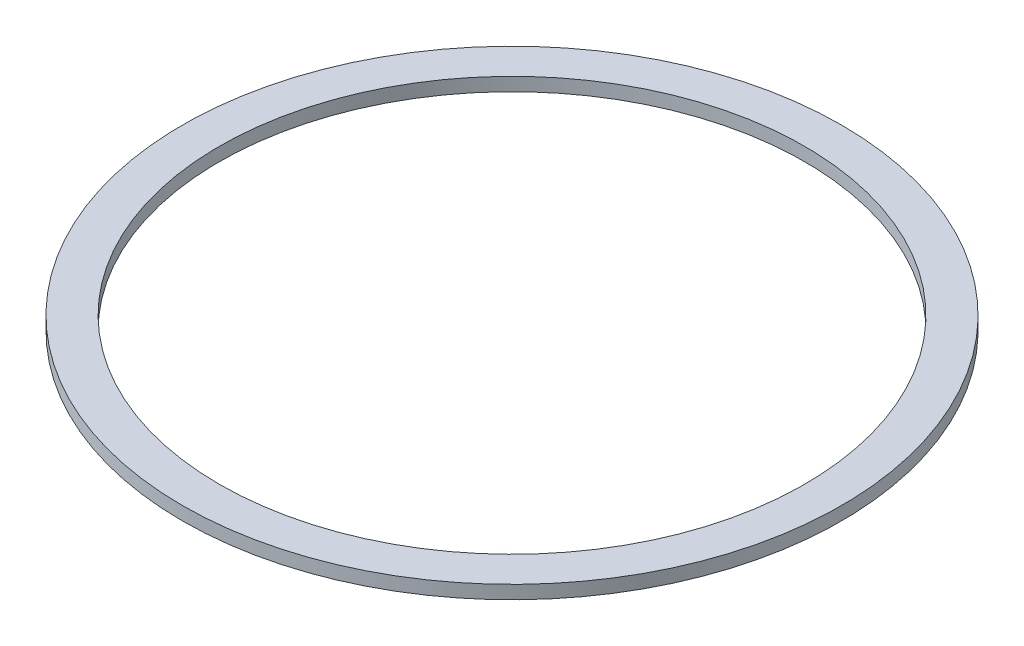
ISO-10303-21;
HEADER;
FILE_DESCRIPTION(('STEP AP214'),'2;1');
FILE_NAME('part.step','',(''),(''),'','','');
FILE_SCHEMA(('AUTOMOTIVE_DESIGN { 1 0 10303 214 1 1 1 1 }'));
ENDSEC;
DATA;
#1=APPLICATION_CONTEXT('core data for automotive mechanical design processes');
#2=APPLICATION_PROTOCOL_DEFINITION('international standard','automotive_design',2000,#1);
#3=PRODUCT_CONTEXT('',#1,'mechanical');
#4=PRODUCT('Part','Part','',(#3));
#5=PRODUCT_RELATED_PRODUCT_CATEGORY('part','',(#4));
#6=PRODUCT_DEFINITION_FORMATION('','',#4);
#7=PRODUCT_DEFINITION_CONTEXT('part definition',#1,'design');
#8=PRODUCT_DEFINITION('design','',#6,#7);
#9=PRODUCT_DEFINITION_SHAPE('','',#8);
#10=(LENGTH_UNIT() NAMED_UNIT(*) SI_UNIT(.MILLI.,.METRE.));
#11=(NAMED_UNIT(*) PLANE_ANGLE_UNIT() SI_UNIT($,.RADIAN.));
#12=(NAMED_UNIT(*) SI_UNIT($,.STERADIAN.) SOLID_ANGLE_UNIT());
#13=UNCERTAINTY_MEASURE_WITH_UNIT(LENGTH_MEASURE(1.E-05),#10,'distance_accuracy_value','');
#14=(GEOMETRIC_REPRESENTATION_CONTEXT(3) GLOBAL_UNCERTAINTY_ASSIGNED_CONTEXT((#13)) GLOBAL_UNIT_ASSIGNED_CONTEXT((#10,
#11,#12)) REPRESENTATION_CONTEXT('',''));
#15=CARTESIAN_POINT('',(0.,0.,0.));
#16=DIRECTION('',(0.,0.,1.));
#17=DIRECTION('',(1.,0.,0.));
#18=AXIS2_PLACEMENT_3D('',#15,#16,#17);
#19=CARTESIAN_POINT('',(0.,3.175,0.));
#20=DIRECTION('',(0.,1.,0.));
#21=DIRECTION('',(0.,0.,1.));
#22=AXIS2_PLACEMENT_3D('',#19,#20,#21);
#23=PLANE('',#22);
#24=CARTESIAN_POINT('',(0.,3.175,0.));
#25=DIRECTION('',(0.,1.,0.));
#26=DIRECTION('',(0.,0.,1.));
#27=AXIS2_PLACEMENT_3D('',#24,#25,#26);
#28=CIRCLE('',#27,78.359);
#29=CARTESIAN_POINT('',(0.,3.175,78.359));
#30=VERTEX_POINT('',#29);
#31=EDGE_CURVE('E10',#30,#30,#28,.T.);
#32=ORIENTED_EDGE('',*,*,#31,.T.);
#33=EDGE_LOOP('',(#32));
#34=FACE_BOUND('',#33,.T.);
#35=CARTESIAN_POINT('',(0.,3.175,0.));
#36=DIRECTION('',(0.,1.,0.));
#37=DIRECTION('',(0.,0.,1.));
#38=AXIS2_PLACEMENT_3D('',#35,#36,#37);
#39=CIRCLE('',#38,69.596);
#40=CARTESIAN_POINT('',(0.,3.175,69.596));
#41=VERTEX_POINT('',#40);
#42=EDGE_CURVE('E54',#41,#41,#39,.T.);
#43=ORIENTED_EDGE('',*,*,#42,.F.);
#44=EDGE_LOOP('',(#43));
#45=FACE_BOUND('',#44,.T.);
#46=ADVANCED_FACE('F41',(#34,#45),#23,.T.);
#47=CARTESIAN_POINT('',(0.,0.,0.));
#48=DIRECTION('',(0.,1.,0.));
#49=DIRECTION('',(0.,0.,1.));
#50=AXIS2_PLACEMENT_3D('',#47,#48,#49);
#51=PLANE('',#50);
#52=CARTESIAN_POINT('',(0.,0.,0.));
#53=DIRECTION('',(0.,1.,0.));
#54=DIRECTION('',(0.,0.,1.));
#55=AXIS2_PLACEMENT_3D('',#52,#53,#54);
#56=CIRCLE('',#55,78.359);
#57=CARTESIAN_POINT('',(0.,0.,78.359));
#58=VERTEX_POINT('',#57);
#59=EDGE_CURVE('E45',#58,#58,#56,.T.);
#60=ORIENTED_EDGE('',*,*,#59,.F.);
#61=EDGE_LOOP('',(#60));
#62=FACE_BOUND('',#61,.T.);
#63=CARTESIAN_POINT('',(0.,0.,0.));
#64=DIRECTION('',(0.,1.,0.));
#65=DIRECTION('',(0.,0.,1.));
#66=AXIS2_PLACEMENT_3D('',#63,#64,#65);
#67=CIRCLE('',#66,69.596);
#68=CARTESIAN_POINT('',(0.,0.,69.596));
#69=VERTEX_POINT('',#68);
#70=EDGE_CURVE('E56',#69,#69,#67,.T.);
#71=ORIENTED_EDGE('',*,*,#70,.T.);
#72=EDGE_LOOP('',(#71));
#73=FACE_BOUND('',#72,.T.);
#74=ADVANCED_FACE('F68',(#62,#73),#51,.F.);
#75=CARTESIAN_POINT('',(0.,3.175,0.));
#76=DIRECTION('',(0.,-1.,0.));
#77=DIRECTION('',(0.,0.,-1.));
#78=AXIS2_PLACEMENT_3D('',#75,#76,#77);
#79=CYLINDRICAL_SURFACE('',#78,78.359);
#80=ORIENTED_EDGE('',*,*,#31,.F.);
#81=EDGE_LOOP('',(#80));
#82=FACE_BOUND('',#81,.T.);
#83=ORIENTED_EDGE('',*,*,#59,.T.);
#84=EDGE_LOOP('',(#83));
#85=FACE_BOUND('',#84,.T.);
#86=ADVANCED_FACE('F43',(#82,#85),#79,.T.);
#87=CARTESIAN_POINT('',(0.,3.175,0.));
#88=DIRECTION('',(0.,-1.,0.));
#89=DIRECTION('',(0.,0.,-1.));
#90=AXIS2_PLACEMENT_3D('',#87,#88,#89);
#91=CYLINDRICAL_SURFACE('',#90,69.596);
#92=ORIENTED_EDGE('',*,*,#42,.T.);
#93=EDGE_LOOP('',(#92));
#94=FACE_BOUND('',#93,.T.);
#95=ORIENTED_EDGE('',*,*,#70,.F.);
#96=EDGE_LOOP('',(#95));
#97=FACE_BOUND('',#96,.T.);
#98=ADVANCED_FACE('F64',(#94,#97),#91,.F.);
#99=CLOSED_SHELL('',(#46,#74,#86,#98));
#100=MANIFOLD_SOLID_BREP('B2',#99);
#101=ADVANCED_BREP_SHAPE_REPRESENTATION('',(#18,#100),#14);
#102=SHAPE_DEFINITION_REPRESENTATION(#9,#101);
ENDSEC;
END-ISO-10303-21;
